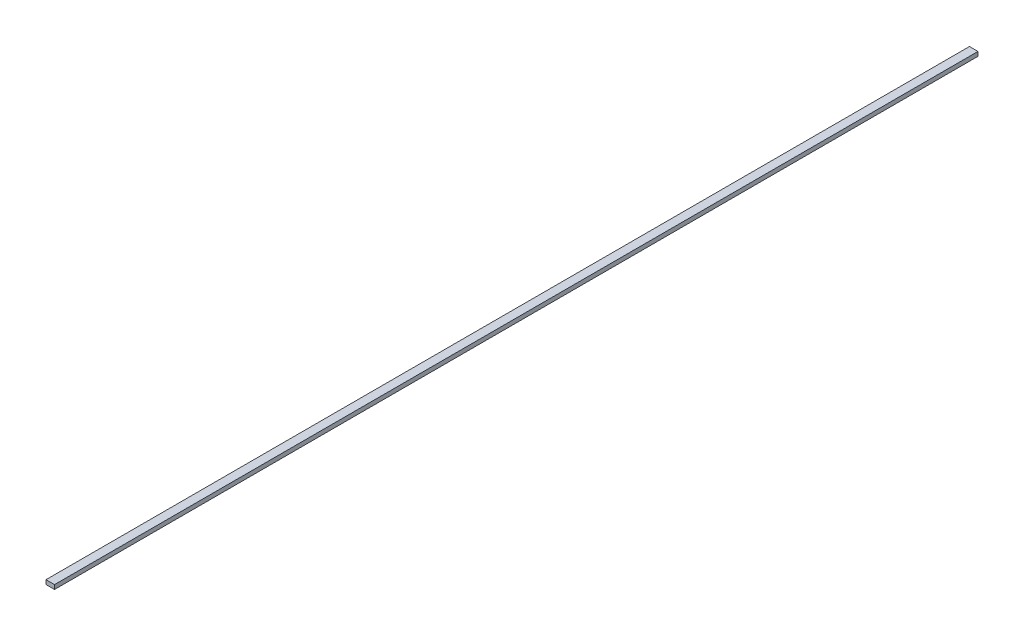
ISO-10303-21;
HEADER;
FILE_DESCRIPTION(('STEP AP214'),'2;1');
FILE_NAME('part.step','',(''),(''),'','','');
FILE_SCHEMA(('AUTOMOTIVE_DESIGN { 1 0 10303 214 1 1 1 1 }'));
ENDSEC;
DATA;
#1=APPLICATION_CONTEXT('core data for automotive mechanical design processes');
#2=APPLICATION_PROTOCOL_DEFINITION('international standard','automotive_design',2000,#1);
#3=PRODUCT_CONTEXT('',#1,'mechanical');
#4=PRODUCT('Part','Part','',(#3));
#5=PRODUCT_RELATED_PRODUCT_CATEGORY('part','',(#4));
#6=PRODUCT_DEFINITION_FORMATION('','',#4);
#7=PRODUCT_DEFINITION_CONTEXT('part definition',#1,'design');
#8=PRODUCT_DEFINITION('design','',#6,#7);
#9=PRODUCT_DEFINITION_SHAPE('','',#8);
#10=(LENGTH_UNIT() NAMED_UNIT(*) SI_UNIT(.MILLI.,.METRE.));
#11=(NAMED_UNIT(*) PLANE_ANGLE_UNIT() SI_UNIT($,.RADIAN.));
#12=(NAMED_UNIT(*) SI_UNIT($,.STERADIAN.) SOLID_ANGLE_UNIT());
#13=UNCERTAINTY_MEASURE_WITH_UNIT(LENGTH_MEASURE(1.E-05),#10,'distance_accuracy_value','');
#14=(GEOMETRIC_REPRESENTATION_CONTEXT(3) GLOBAL_UNCERTAINTY_ASSIGNED_CONTEXT((#13)) GLOBAL_UNIT_ASSIGNED_CONTEXT((#10,
#11,#12)) REPRESENTATION_CONTEXT('',''));
#15=CARTESIAN_POINT('',(0.,0.,0.));
#16=DIRECTION('',(0.,0.,1.));
#17=DIRECTION('',(1.,0.,0.));
#18=AXIS2_PLACEMENT_3D('',#15,#16,#17);
#19=CARTESIAN_POINT('',(0.,0.,-690.));
#20=DIRECTION('',(-1.,0.,0.));
#21=DIRECTION('',(0.,0.,1.));
#22=AXIS2_PLACEMENT_3D('',#19,#20,#21);
#23=PLANE('',#22);
#24=DIRECTION('',(0.,-1.,0.));
#25=VECTOR('',#24,1.);
#26=CARTESIAN_POINT('',(0.,0.,-40.));
#27=LINE('',#26,#25);
#28=CARTESIAN_POINT('',(0.,3.,-40.));
#29=VERTEX_POINT('',#28);
#30=CARTESIAN_POINT('',(0.,0.,-40.));
#31=VERTEX_POINT('',#30);
#32=EDGE_CURVE('E103',#29,#31,#27,.T.);
#33=ORIENTED_EDGE('',*,*,#32,.F.);
#34=DIRECTION('',(0.,0.,1.));
#35=VECTOR('',#34,1.);
#36=CARTESIAN_POINT('',(0.,3.,-690.));
#37=LINE('',#36,#35);
#38=CARTESIAN_POINT('',(0.,3.,-690.));
#39=VERTEX_POINT('',#38);
#40=EDGE_CURVE('E11',#39,#29,#37,.T.);
#41=ORIENTED_EDGE('',*,*,#40,.F.);
#42=DIRECTION('',(0.,-1.,0.));
#43=VECTOR('',#42,1.);
#44=CARTESIAN_POINT('',(0.,0.,-690.));
#45=LINE('',#44,#43);
#46=CARTESIAN_POINT('',(0.,0.,-690.));
#47=VERTEX_POINT('',#46);
#48=EDGE_CURVE('E97',#39,#47,#45,.T.);
#49=ORIENTED_EDGE('',*,*,#48,.T.);
#50=DIRECTION('',(0.,0.,1.));
#51=VECTOR('',#50,1.);
#52=CARTESIAN_POINT('',(0.,0.,-690.));
#53=LINE('',#52,#51);
#54=EDGE_CURVE('E42',#47,#31,#53,.T.);
#55=ORIENTED_EDGE('',*,*,#54,.T.);
#56=EDGE_LOOP('',(#33,#41,#49,#55));
#57=FACE_BOUND('',#56,.T.);
#58=ADVANCED_FACE('F39',(#57),#23,.T.);
#59=CARTESIAN_POINT('',(0.,3.,-690.));
#60=DIRECTION('',(0.,1.,0.));
#61=DIRECTION('',(0.,0.,1.));
#62=AXIS2_PLACEMENT_3D('',#59,#60,#61);
#63=PLANE('',#62);
#64=DIRECTION('',(-1.,0.,0.));
#65=VECTOR('',#64,1.);
#66=CARTESIAN_POINT('',(0.,3.,-40.));
#67=LINE('',#66,#65);
#68=CARTESIAN_POINT('',(6.,3.,-40.));
#69=VERTEX_POINT('',#68);
#70=EDGE_CURVE('E99',#69,#29,#67,.T.);
#71=ORIENTED_EDGE('',*,*,#70,.F.);
#72=DIRECTION('',(0.,0.,1.));
#73=VECTOR('',#72,1.);
#74=CARTESIAN_POINT('',(6.,3.,-690.));
#75=LINE('',#74,#73);
#76=CARTESIAN_POINT('',(6.,3.,-690.));
#77=VERTEX_POINT('',#76);
#78=EDGE_CURVE('E48',#77,#69,#75,.T.);
#79=ORIENTED_EDGE('',*,*,#78,.F.);
#80=DIRECTION('',(-1.,0.,0.));
#81=VECTOR('',#80,1.);
#82=CARTESIAN_POINT('',(0.,3.,-690.));
#83=LINE('',#82,#81);
#84=EDGE_CURVE('E94',#77,#39,#83,.T.);
#85=ORIENTED_EDGE('',*,*,#84,.T.);
#86=ORIENTED_EDGE('',*,*,#40,.T.);
#87=EDGE_LOOP('',(#71,#79,#85,#86));
#88=FACE_BOUND('',#87,.T.);
#89=ADVANCED_FACE('F113',(#88),#63,.T.);
#90=CARTESIAN_POINT('',(6.,0.,-690.));
#91=DIRECTION('',(1.,0.,0.));
#92=DIRECTION('',(0.,0.,-1.));
#93=AXIS2_PLACEMENT_3D('',#90,#91,#92);
#94=PLANE('',#93);
#95=DIRECTION('',(0.,1.,0.));
#96=VECTOR('',#95,1.);
#97=CARTESIAN_POINT('',(6.,0.,-40.));
#98=LINE('',#97,#96);
#99=CARTESIAN_POINT('',(6.,0.,-40.));
#100=VERTEX_POINT('',#99);
#101=EDGE_CURVE('E89',#100,#69,#98,.T.);
#102=ORIENTED_EDGE('',*,*,#101,.F.);
#103=DIRECTION('',(0.,0.,1.));
#104=VECTOR('',#103,1.);
#105=CARTESIAN_POINT('',(6.,0.,-690.));
#106=LINE('',#105,#104);
#107=CARTESIAN_POINT('',(6.,0.,-690.));
#108=VERTEX_POINT('',#107);
#109=EDGE_CURVE('E84',#108,#100,#106,.T.);
#110=ORIENTED_EDGE('',*,*,#109,.F.);
#111=DIRECTION('',(0.,1.,0.));
#112=VECTOR('',#111,1.);
#113=CARTESIAN_POINT('',(6.,0.,-690.));
#114=LINE('',#113,#112);
#115=EDGE_CURVE('E87',#108,#77,#114,.T.);
#116=ORIENTED_EDGE('',*,*,#115,.T.);
#117=ORIENTED_EDGE('',*,*,#78,.T.);
#118=EDGE_LOOP('',(#102,#110,#116,#117));
#119=FACE_BOUND('',#118,.T.);
#120=ADVANCED_FACE('F86',(#119),#94,.T.);
#121=CARTESIAN_POINT('',(0.,0.,-690.));
#122=DIRECTION('',(0.,-1.,0.));
#123=DIRECTION('',(0.,0.,-1.));
#124=AXIS2_PLACEMENT_3D('',#121,#122,#123);
#125=PLANE('',#124);
#126=DIRECTION('',(1.,0.,0.));
#127=VECTOR('',#126,1.);
#128=CARTESIAN_POINT('',(0.,0.,-40.));
#129=LINE('',#128,#127);
#130=EDGE_CURVE('E106',#31,#100,#129,.T.);
#131=ORIENTED_EDGE('',*,*,#130,.F.);
#132=ORIENTED_EDGE('',*,*,#54,.F.);
#133=DIRECTION('',(1.,0.,0.));
#134=VECTOR('',#133,1.);
#135=CARTESIAN_POINT('',(0.,0.,-690.));
#136=LINE('',#135,#134);
#137=EDGE_CURVE('E93',#47,#108,#136,.T.);
#138=ORIENTED_EDGE('',*,*,#137,.T.);
#139=ORIENTED_EDGE('',*,*,#109,.T.);
#140=EDGE_LOOP('',(#131,#132,#138,#139));
#141=FACE_BOUND('',#140,.T.);
#142=ADVANCED_FACE('F96',(#141),#125,.T.);
#143=CARTESIAN_POINT('',(0.,0.,-690.));
#144=DIRECTION('',(0.,0.,-1.));
#145=DIRECTION('',(-1.,0.,0.));
#146=AXIS2_PLACEMENT_3D('',#143,#144,#145);
#147=PLANE('',#146);
#148=ORIENTED_EDGE('',*,*,#48,.F.);
#149=ORIENTED_EDGE('',*,*,#84,.F.);
#150=ORIENTED_EDGE('',*,*,#115,.F.);
#151=ORIENTED_EDGE('',*,*,#137,.F.);
#152=EDGE_LOOP('',(#148,#149,#150,#151));
#153=FACE_BOUND('',#152,.T.);
#154=ADVANCED_FACE('F92',(#153),#147,.T.);
#155=CARTESIAN_POINT('',(0.,0.,-40.));
#156=DIRECTION('',(0.,0.,-1.));
#157=DIRECTION('',(-1.,0.,0.));
#158=AXIS2_PLACEMENT_3D('',#155,#156,#157);
#159=PLANE('',#158);
#160=ORIENTED_EDGE('',*,*,#32,.T.);
#161=ORIENTED_EDGE('',*,*,#130,.T.);
#162=ORIENTED_EDGE('',*,*,#101,.T.);
#163=ORIENTED_EDGE('',*,*,#70,.T.);
#164=EDGE_LOOP('',(#160,#161,#162,#163));
#165=FACE_BOUND('',#164,.T.);
#166=ADVANCED_FACE('F112',(#165),#159,.F.);
#167=CLOSED_SHELL('',(#58,#89,#120,#142,#154,#166));
#168=MANIFOLD_SOLID_BREP('B2',#167);
#169=ADVANCED_BREP_SHAPE_REPRESENTATION('',(#18,#168),#14);
#170=SHAPE_DEFINITION_REPRESENTATION(#9,#169);
ENDSEC;
END-ISO-10303-21;
